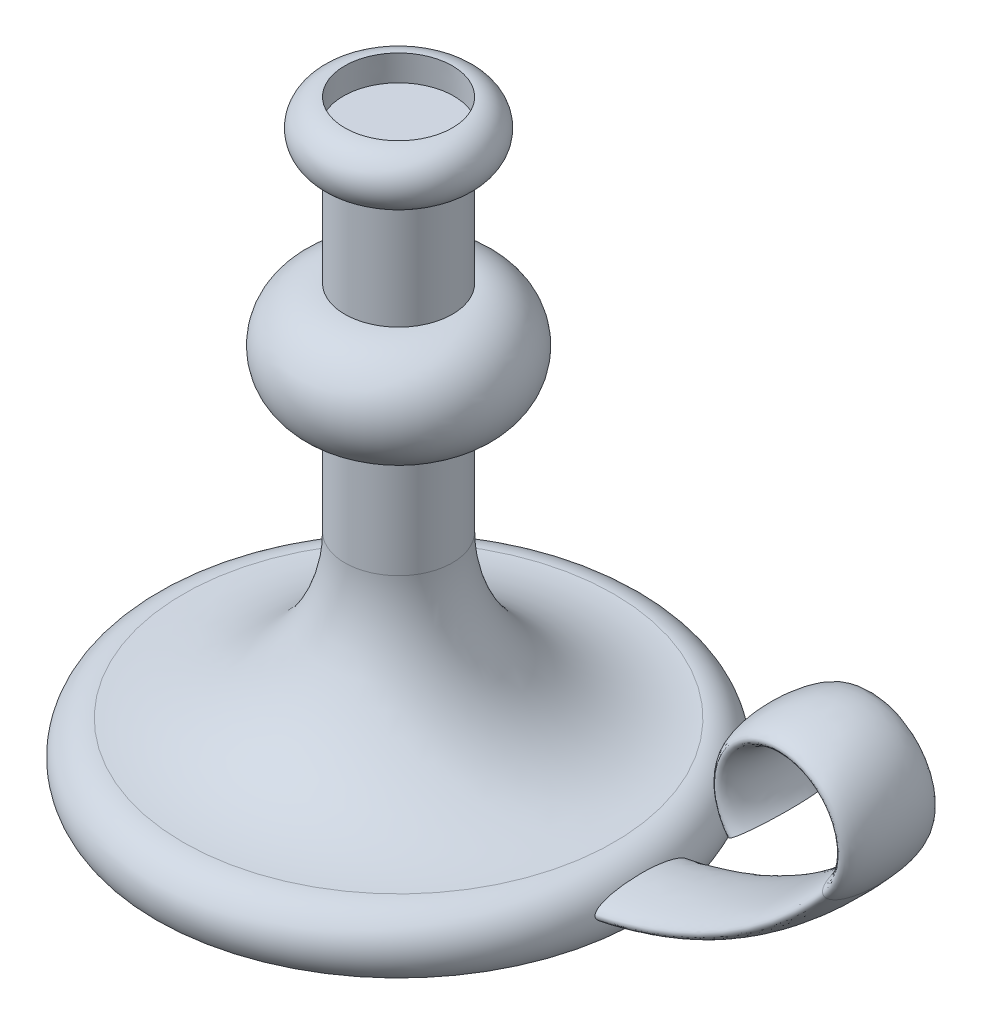
ISO-10303-21;
HEADER;
FILE_DESCRIPTION(('STEP AP214'),'2;1');
FILE_NAME('part.step','',(''),(''),'','','');
FILE_SCHEMA(('AUTOMOTIVE_DESIGN { 1 0 10303 214 1 1 1 1 }'));
ENDSEC;
DATA;
#1=APPLICATION_CONTEXT('core data for automotive mechanical design processes');
#2=APPLICATION_PROTOCOL_DEFINITION('international standard','automotive_design',2000,#1);
#3=PRODUCT_CONTEXT('',#1,'mechanical');
#4=PRODUCT('Part','Part','',(#3));
#5=PRODUCT_RELATED_PRODUCT_CATEGORY('part','',(#4));
#6=PRODUCT_DEFINITION_FORMATION('','',#4);
#7=PRODUCT_DEFINITION_CONTEXT('part definition',#1,'design');
#8=PRODUCT_DEFINITION('design','',#6,#7);
#9=PRODUCT_DEFINITION_SHAPE('','',#8);
#10=(LENGTH_UNIT() NAMED_UNIT(*) SI_UNIT(.MILLI.,.METRE.));
#11=(NAMED_UNIT(*) PLANE_ANGLE_UNIT() SI_UNIT($,.RADIAN.));
#12=(NAMED_UNIT(*) SI_UNIT($,.STERADIAN.) SOLID_ANGLE_UNIT());
#13=UNCERTAINTY_MEASURE_WITH_UNIT(LENGTH_MEASURE(1.E-05),#10,'distance_accuracy_value','');
#14=(GEOMETRIC_REPRESENTATION_CONTEXT(3) GLOBAL_UNCERTAINTY_ASSIGNED_CONTEXT((#13)) GLOBAL_UNIT_ASSIGNED_CONTEXT((#10,
#11,#12)) REPRESENTATION_CONTEXT('',''));
#15=CARTESIAN_POINT('',(0.,0.,0.));
#16=DIRECTION('',(0.,0.,1.));
#17=DIRECTION('',(1.,0.,0.));
#18=AXIS2_PLACEMENT_3D('',#15,#16,#17);
#19=CARTESIAN_POINT('',(-90.,7.50000000000001,0.));
#20=DIRECTION('',(0.,-1.,0.));
#21=DIRECTION('',(0.,0.,-1.));
#22=AXIS2_PLACEMENT_3D('',#19,#20,#21);
#23=TOROIDAL_SURFACE('',#22,80.,12.5);
#24=CARTESIAN_POINT('',(0.,15.,0.));
#25=CARTESIAN_POINT('',(4.00136066375103E-09,14.9999994497197,0.448956188430466));
#26=CARTESIAN_POINT('',(0.000296676791633574,14.9951315783748,0.89791029190739));
#27=CARTESIAN_POINT('',(0.00148426535672316,14.9755802493735,1.79561818556669));
#28=CARTESIAN_POINT('',(0.0023751969340055,14.9608965306953,2.24437197010465));
#29=CARTESIAN_POINT('',(0.00475618683708935,14.9214645130944,3.14163779596307));
#30=CARTESIAN_POINT('',(0.00624651153050312,14.8967117394729,3.5901496409155));
#31=CARTESIAN_POINT('',(0.00983950291390878,14.8367197750877,4.48646507343132));
#32=CARTESIAN_POINT('',(0.0119421583532634,14.8014807769919,4.93426867385563));
#33=CARTESIAN_POINT('',(0.0168039131396081,14.7196781019656,5.83105743053013));
#34=CARTESIAN_POINT('',(0.0195661808914007,14.6730597402329,6.28003761296034));
#35=CARTESIAN_POINT('',(0.0258101594271934,14.5676597295138,7.17660128498844));
#36=CARTESIAN_POINT('',(0.0292919120149101,14.5088773737711,7.62418469189589));
#37=CARTESIAN_POINT('',(0.0371035958626952,14.3779036804495,8.51695838149349));
#38=CARTESIAN_POINT('',(0.0414327251328532,14.3057250249644,8.96215052118495));
#39=CARTESIAN_POINT('',(0.0511767239490269,14.146095230462,9.84974625085139));
#40=CARTESIAN_POINT('',(0.056591411830917,14.0586466471249,10.292150294644));
#41=CARTESIAN_POINT('',(0.0658784735150738,13.9136040316498,10.9544618168075));
#42=CARTESIAN_POINT('',(0.0691831496444707,13.8627245941951,11.1758560246011));
#43=CARTESIAN_POINT('',(0.0762680996451903,13.7558982476464,11.6174559690568));
#44=CARTESIAN_POINT('',(0.080048450827369,13.6999505152239,11.8376615064446));
#45=CARTESIAN_POINT('',(0.0882009652144471,13.5823657906581,12.2767142381229));
#46=CARTESIAN_POINT('',(0.0925735548836065,13.5207247090667,12.495560333621));
#47=CARTESIAN_POINT('',(0.102073179815301,13.3909290728711,12.931675379863));
#48=CARTESIAN_POINT('',(0.10720137461062,13.3227645649532,13.1489413582842));
#49=CARTESIAN_POINT('',(0.118367024294746,13.1797701844285,13.5787081761395));
#50=CARTESIAN_POINT('',(0.124394280745832,13.1050184967943,13.7912351114996));
#51=CARTESIAN_POINT('',(0.13769755668382,12.9469808482804,14.2129907834615));
#52=CARTESIAN_POINT('',(0.144973166453467,12.8636976910841,14.4222205776829));
#53=CARTESIAN_POINT('',(0.16119666075411,12.6869711964811,14.8358640432876));
#54=CARTESIAN_POINT('',(0.170141201965216,12.5935483255053,15.0402864389843));
#55=CARTESIAN_POINT('',(0.185317365030083,12.4438654982324,15.3418951754295));
#56=CARTESIAN_POINT('',(0.190664702565056,12.3924214171975,15.4415220335929));
#57=CARTESIAN_POINT('',(0.202068003915101,12.28589634643,15.6387640974776));
#58=CARTESIAN_POINT('',(0.208123843766788,12.2308159936518,15.7363796516027));
#59=CARTESIAN_POINT('',(0.218955954607548,12.135340885532,15.8973174870784));
#60=CARTESIAN_POINT('',(0.223495860513944,12.0960912912869,15.9613357279317));
#61=CARTESIAN_POINT('',(0.233019106016297,12.0155253443327,16.0880386000506));
#62=CARTESIAN_POINT('',(0.238002489438599,11.9742087875346,16.1507230987499));
#63=CARTESIAN_POINT('',(0.248488516873019,11.8892199174485,16.274600871182));
#64=CARTESIAN_POINT('',(0.253992073685059,11.8455435228618,16.3357912772013));
#65=CARTESIAN_POINT('',(0.26559176639468,11.7556518236339,16.4562249162673));
#66=CARTESIAN_POINT('',(0.27168788231332,11.7094366046156,16.5154682148734));
#67=CARTESIAN_POINT('',(0.284622322029261,11.6137925179577,16.6320417668829));
#68=CARTESIAN_POINT('',(0.291466262659284,11.5643406331173,16.6893526157181));
#69=CARTESIAN_POINT('',(0.305972807821384,11.4622481172203,16.8009458739084));
#70=CARTESIAN_POINT('',(0.313635226151452,11.4096082126066,16.8552289678122));
#71=CARTESIAN_POINT('',(0.32990695913246,11.3008718633043,16.959908268499));
#72=CARTESIAN_POINT('',(0.338514690013063,11.2447812671999,17.0103107428832));
#73=CARTESIAN_POINT('',(0.356839384154058,11.1287808893653,17.1062491388969));
#74=CARTESIAN_POINT('',(0.366555633247546,11.0688735774328,17.151788157615));
#75=CARTESIAN_POINT('',(0.389218719599872,10.9333024827652,17.2446888818732));
#76=CARTESIAN_POINT('',(0.402429390401396,10.8567955376911,17.290779906632));
#77=CARTESIAN_POINT('',(0.430892815553735,10.6981155934272,17.3712869934412));
#78=CARTESIAN_POINT('',(0.446143620915371,10.6159480378477,17.4057140887813));
#79=CARTESIAN_POINT('',(0.470654566792556,10.4889246095076,17.4463446054981));
#80=CARTESIAN_POINT('',(0.47915766538093,10.4456629216364,17.4580924532366));
#81=CARTESIAN_POINT('',(0.496657520218973,10.358324899221,17.4774175517797));
#82=CARTESIAN_POINT('',(0.505654017614358,10.3142489997396,17.4849969669022));
#83=CARTESIAN_POINT('',(0.524082128789851,10.2256763713688,17.4957191379504));
#84=CARTESIAN_POINT('',(0.533513448539278,10.181179942573,17.4988648478313));
#85=CARTESIAN_POINT('',(0.552732604938945,10.0921886570592,17.5006242214686));
#86=CARTESIAN_POINT('',(0.562520406758551,10.0476938006105,17.4992383268242));
#87=CARTESIAN_POINT('',(0.589809326137845,9.92589657293411,17.4892286295307));
#88=CARTESIAN_POINT('',(0.607593578556012,9.84899848149995,17.4759587675723));
#89=CARTESIAN_POINT('',(0.643443935685934,9.69854273561217,17.4370059318332));
#90=CARTESIAN_POINT('',(0.661510282648553,9.62498819150613,17.4113116486536));
#91=CARTESIAN_POINT('',(0.705490110958442,9.45072180835713,17.336043039321));
#92=CARTESIAN_POINT('',(0.731336732448134,9.35240328839828,17.2809326566284));
#93=CARTESIAN_POINT('',(0.782155853050861,9.16542625609002,17.1556774097134));
#94=CARTESIAN_POINT('',(0.807124325252125,9.07680908468279,17.0854717160375));
#95=CARTESIAN_POINT('',(0.853839166700286,8.91572027289973,16.9412721247792));
#96=CARTESIAN_POINT('',(0.875678879513329,8.84251637772033,16.868109576555));
#97=CARTESIAN_POINT('',(0.918373454452256,8.702723130117,16.7157486254467));
#98=CARTESIAN_POINT('',(0.939229829477058,8.63612343030385,16.6365600195954));
#99=CARTESIAN_POINT('',(0.980118857943369,8.50825118052925,16.4733857441314));
#100=CARTESIAN_POINT('',(1.0001484937417,8.44699736840472,16.3893847863668));
#101=CARTESIAN_POINT('',(1.03938445815114,8.32924935876869,16.2179074493931));
#102=CARTESIAN_POINT('',(1.05859050132743,8.27275680493507,16.1304298852043));
#103=CARTESIAN_POINT('',(1.09692788915067,8.16190441683603,15.9495518254795));
#104=CARTESIAN_POINT('',(1.11603081334396,8.10769814100521,15.8560517188092));
#105=CARTESIAN_POINT('',(1.15348519635834,8.00312126922495,15.6667753392033));
#106=CARTESIAN_POINT('',(1.17183651710318,7.95275137660516,15.5709986531018));
#107=CARTESIAN_POINT('',(1.22589843096843,7.80652975916977,15.2806948213763));
#108=CARTESIAN_POINT('',(1.26056678967678,7.71570944684017,15.0834347297137));
#109=CARTESIAN_POINT('',(1.3275054151541,7.54457609231538,14.6839053773838));
#110=CARTESIAN_POINT('',(1.35977370807988,7.46427165811553,14.4816321722007));
#111=CARTESIAN_POINT('',(1.42228719387726,7.31196496634719,14.0726615329247));
#112=CARTESIAN_POINT('',(1.45252285536449,7.24000081269111,13.86594854247));
#113=CARTESIAN_POINT('',(1.51098018261334,7.10343955543567,13.4500936000043));
#114=CARTESIAN_POINT('',(1.53920398913047,7.03883457600462,13.2409545137203));
#115=CARTESIAN_POINT('',(1.59381509585393,6.91587362505721,12.820679420431));
#116=CARTESIAN_POINT('',(1.62020285829187,6.85751607871685,12.6095439313436));
#117=CARTESIAN_POINT('',(1.6782912141221,6.7309174626096,12.1273204890441));
#118=CARTESIAN_POINT('',(1.70945562867532,6.66437565537476,11.8557227000826));
#119=CARTESIAN_POINT('',(1.7691818432094,6.53886803603065,11.3104849250448));
#120=CARTESIAN_POINT('',(1.79774338427144,6.47990297737393,11.0368447387254));
#121=CARTESIAN_POINT('',(1.85241000916518,6.36860080545923,10.4878381875617));
#122=CARTESIAN_POINT('',(1.87851386423206,6.31626700314399,10.2124710319004));
#123=CARTESIAN_POINT('',(1.92835362791844,6.21755215774785,9.6604539345288));
#124=CARTESIAN_POINT('',(1.95208942645175,6.17117139138298,9.38380393380652));
#125=CARTESIAN_POINT('',(2.01973891760805,6.04035093105532,8.55392726465563));
#126=CARTESIAN_POINT('',(2.06025504694118,5.96391167526709,7.99914952971862));
#127=CARTESIAN_POINT('',(2.13266056647685,5.82927206017896,6.88700831967625));
#128=CARTESIAN_POINT('',(2.16455191558734,5.77106755882388,6.32964546101966));
#129=CARTESIAN_POINT('',(2.21994358359585,5.67100943205034,5.21453688546995));
#130=CARTESIAN_POINT('',(2.24346584393131,5.62911302376262,4.65679606852568));
#131=CARTESIAN_POINT('',(2.28242702411834,5.56016917445445,3.54009574455338));
#132=CARTESIAN_POINT('',(2.29786548909978,5.53312256901901,2.98113617072334));
#133=CARTESIAN_POINT('',(2.32077316771089,5.49311497106455,1.86240610711977));
#134=CARTESIAN_POINT('',(2.32824026547082,5.48015771831805,1.30263544151724));
#135=CARTESIAN_POINT('',(2.33524968984361,5.46799232440565,0.182909852228347));
#136=CARTESIAN_POINT('',(2.33479220290748,5.46878385975589,-0.377045066812897));
#137=CARTESIAN_POINT('',(2.32595173394535,5.48413308455225,-1.49645782109217));
#138=CARTESIAN_POINT('',(2.31757225399418,5.49868469108541,-2.05591576664592));
#139=CARTESIAN_POINT('',(2.29283413640675,5.54193872652747,-3.1741311483376));
#140=CARTESIAN_POINT('',(2.27647525493318,5.5706415878756,-3.73288856254529));
#141=CARTESIAN_POINT('',(2.23564355337782,5.64303913525244,-4.84952138059804));
#142=CARTESIAN_POINT('',(2.21116526811534,5.68674391978642,-5.40739593536645));
#143=CARTESIAN_POINT('',(2.15390006615734,5.79048248729832,-6.52118127632253));
#144=CARTESIAN_POINT('',(2.12111378868433,5.85051501403481,-7.07709221025748));
#145=CARTESIAN_POINT('',(2.0541204611787,5.97558716121164,-8.07841526432367));
#146=CARTESIAN_POINT('',(2.0214242352851,6.03739352007808,-8.52433259038765));
#147=CARTESIAN_POINT('',(1.95019218401476,6.17462063053653,-9.41360241823714));
#148=CARTESIAN_POINT('',(1.91165685165609,6.25004023281311,-9.85695513328457));
#149=CARTESIAN_POINT('',(1.84924904744865,6.37509852907475,-10.5188793676165));
#150=CARTESIAN_POINT('',(1.82769963174182,6.41872983515496,-10.7388141409483));
#151=CARTESIAN_POINT('',(1.78299844658497,6.51039197928664,-11.1775983577783));
#152=CARTESIAN_POINT('',(1.75984674016771,6.55842264429511,-11.3964478436082));
#153=CARTESIAN_POINT('',(1.71187544274957,6.65936243204591,-11.8327734041331));
#154=CARTESIAN_POINT('',(1.68705631775133,6.71227019328477,-12.0502498441261));
#155=CARTESIAN_POINT('',(1.6356552459579,6.82359622083417,-12.4835708027006));
#156=CARTESIAN_POINT('',(1.60907343411187,6.88201406544372,-12.6994154448044));
#157=CARTESIAN_POINT('',(1.56285228325073,6.98543097402565,-13.0601908839734));
#158=CARTESIAN_POINT('',(1.54371885650708,7.0287289087183,-13.2056747166128));
#159=CARTESIAN_POINT('',(1.50453796620535,7.11856455301719,-13.4955184679914));
#160=CARTESIAN_POINT('',(1.48449050424008,7.16510225697783,-13.6398783886885));
#161=CARTESIAN_POINT('',(1.44338900289861,7.26189329054609,-13.9275108742021));
#162=CARTESIAN_POINT('',(1.42233316464617,7.31215335500639,-14.0707809240799));
#163=CARTESIAN_POINT('',(1.37918305955226,7.41679388937564,-14.3556500390527));
#164=CARTESIAN_POINT('',(1.35708883153739,7.47117420527006,-14.4972491663782));
#165=CARTESIAN_POINT('',(1.30991676974758,7.58932557549082,-14.7899200827552));
#166=CARTESIAN_POINT('',(1.28474294822605,7.65350109369699,-14.9408142415825));
#167=CARTESIAN_POINT('',(1.23294136023365,7.78840456018522,-15.2394730429242));
#168=CARTESIAN_POINT('',(1.20631314348116,7.8591345425091,-15.3872366963552));
#169=CARTESIAN_POINT('',(1.15152425902849,8.00823786551704,-15.6780238059822));
#170=CARTESIAN_POINT('',(1.1233684184954,8.08658768646935,-15.8210601304825));
#171=CARTESIAN_POINT('',(1.06525806218454,8.25285449238241,-16.1010286055296));
#172=CARTESIAN_POINT('',(1.03530502312148,8.34076366962448,-16.2379656107973));
#173=CARTESIAN_POINT('',(0.979506895840379,8.50995847979828,-16.4764842107671));
#174=CARTESIAN_POINT('',(0.954031021702917,8.58907899731623,-16.5796774006535));
#175=CARTESIAN_POINT('',(0.901553047238521,8.75699774405995,-16.7780575724107));
#176=CARTESIAN_POINT('',(0.874547984665965,8.84581508910878,-16.8732280599377));
#177=CARTESIAN_POINT('',(0.832726364762453,8.9882531341359,-17.0071868586344));
#178=CARTESIAN_POINT('',(0.818462100669291,9.03764725540926,-17.0506465272524));
#179=CARTESIAN_POINT('',(0.78955831300976,9.1396435483334,-17.1335543255225));
#180=CARTESIAN_POINT('',(0.774918704270406,9.19224645192167,-17.1730015343997));
#181=CARTESIAN_POINT('',(0.745371465591174,9.3006145319494,-17.2467439737832));
#182=CARTESIAN_POINT('',(0.730465022567097,9.35636733673326,-17.2810576596561));
#183=CARTESIAN_POINT('',(0.700446875015215,9.47115244391441,-17.3434846395811));
#184=CARTESIAN_POINT('',(0.685335366463668,9.53018176174129,-17.371603464146));
#185=CARTESIAN_POINT('',(0.651883420448297,9.66401040390637,-17.4254586950433));
#186=CARTESIAN_POINT('',(0.633529222532389,9.73952431489098,-17.4494643441858));
#187=CARTESIAN_POINT('',(0.597227209589298,9.89360991536375,-17.4842543960026));
#188=CARTESIAN_POINT('',(0.57927895350963,9.97217800640714,-17.495053898554));
#189=CARTESIAN_POINT('',(0.544279807552026,10.1304546049939,-17.5022476016854));
#190=CARTESIAN_POINT('',(0.527231917168584,10.210165921869,-17.4985963943378));
#191=CARTESIAN_POINT('',(0.494572106072305,10.3679878233487,-17.4772137147976));
#192=CARTESIAN_POINT('',(0.478961519284778,10.4460968697125,-17.4594693071608));
#193=CARTESIAN_POINT('',(0.445814586185247,10.6174059753819,-17.4058885855391));
#194=CARTESIAN_POINT('',(0.428740142884819,10.7096282448974,-17.3666903139956));
#195=CARTESIAN_POINT('',(0.397107912736479,10.8870855268672,-17.2738241098204));
#196=CARTESIAN_POINT('',(0.382559020961001,10.9722953084673,-17.2201066728658));
#197=CARTESIAN_POINT('',(0.357873695826012,11.1221437912039,-17.1119129407358));
#198=CARTESIAN_POINT('',(0.347404531533679,11.1878727293404,-17.0589847922131));
#199=CARTESIAN_POINT('',(0.327801842536102,11.3145468526521,-16.9476847722581));
#200=CARTESIAN_POINT('',(0.318666410798626,11.3754988092106,-16.8893208727741));
#201=CARTESIAN_POINT('',(0.301474774433072,11.4933860711778,-16.7681865356141));
#202=CARTESIAN_POINT('',(0.293422151509892,11.5503077649902,-16.7054024719816));
#203=CARTESIAN_POINT('',(0.278249232253772,11.6604071170972,-16.5765156028998));
#204=CARTESIAN_POINT('',(0.271129249474089,11.7135835134606,-16.5104116915992));
#205=CARTESIAN_POINT('',(0.251744208739733,11.8619944817705,-16.3162397321825));
#206=CARTESIAN_POINT('',(0.240469296673406,11.9530318586825,-16.1848642829685));
#207=CARTESIAN_POINT('',(0.219932564134059,12.1257956488315,-15.9158226080988));
#208=CARTESIAN_POINT('',(0.210673804221832,12.2075078179556,-15.7781471970731));
#209=CARTESIAN_POINT('',(0.193682542169238,12.3632547645709,-15.4983218325458));
#210=CARTESIAN_POINT('',(0.185951202811857,12.4372836728148,-15.356168564894));
#211=CARTESIAN_POINT('',(0.171638861897949,12.5791850443386,-15.0679814824583));
#212=CARTESIAN_POINT('',(0.165063287392445,12.6470277787905,-14.9219328843867));
#213=CARTESIAN_POINT('',(0.152855730008377,12.7770802203035,-14.6274984422368));
#214=CARTESIAN_POINT('',(0.147222809397824,12.8392954967793,-14.4791150834765));
#215=CARTESIAN_POINT('',(0.136706009623449,12.9588969882584,-14.1804369079987));
#216=CARTESIAN_POINT('',(0.131821965657471,13.0162842644813,-14.0301425197402));
#217=CARTESIAN_POINT('',(0.121405936070332,13.1419481726649,-13.686675989007));
#218=CARTESIAN_POINT('',(0.11606202532566,13.2089108582432,-13.4930181564866));
#219=CARTESIAN_POINT('',(0.106137873804903,13.3369190811422,-13.1037268392805));
#220=CARTESIAN_POINT('',(0.101557717595538,13.3979639629012,-12.908093138357));
#221=CARTESIAN_POINT('',(0.0930025729445725,13.514870991614,-12.5151733108002));
#222=CARTESIAN_POINT('',(0.0890278748627422,13.5707306469022,-12.317886438903));
#223=CARTESIAN_POINT('',(0.0815699590942184,13.6777943859889,-11.9220405548435));
#224=CARTESIAN_POINT('',(0.0780867664882952,13.7289982321611,-11.7234814783026));
#225=CARTESIAN_POINT('',(0.068254817384734,13.8760522417917,-11.1273371329439));
#226=CARTESIAN_POINT('',(0.0625011103101949,13.9656628473225,-10.728194973237));
#227=CARTESIAN_POINT('',(0.0521128978390205,14.1308358772329,-9.92713912078157));
#228=CARTESIAN_POINT('',(0.0474781502954875,14.2064013402163,-9.52522604706719));
#229=CARTESIAN_POINT('',(0.0380240488500783,14.3622839867773,-8.62094793646116));
#230=CARTESIAN_POINT('',(0.0334356795995107,14.4392602667863,-8.11800526027913));
#231=CARTESIAN_POINT('',(0.0252663204600051,14.5767718846832,-7.1097635166019));
#232=CARTESIAN_POINT('',(0.0216856017909233,14.6373027959742,-6.60446385183166));
#233=CARTESIAN_POINT('',(0.0153888377796762,14.743525278235,-5.59224751844832));
#234=CARTESIAN_POINT('',(0.0126729030563662,14.7892149508024,-5.08533065134036));
#235=CARTESIAN_POINT('',(0.00803780031937021,14.8668680302619,-4.07017088274939));
#236=CARTESIAN_POINT('',(0.00611907229876246,14.8988238575253,-3.56192740437793));
#237=CARTESIAN_POINT('',(0.00305458103020622,14.9496805977589,-2.54487002794396));
#238=CARTESIAN_POINT('',(0.00190869705913493,14.9685835496817,-2.03605623141237));
#239=CARTESIAN_POINT('',(0.000381438032056879,14.9937430043885,-1.01816071124354));
#240=CARTESIAN_POINT('',(-4.53721053147645E-09,15.0000006239722,-0.509079015238947));
#241=CARTESIAN_POINT('',(0.,15.,0.));
#242=B_SPLINE_CURVE_WITH_KNOTS('',3,(#24,#25,#26,#27,#28,#29,#30,#31,#32,#33,#34,#35,#36,#37,
#38,#39,#40,#41,#42,#43,#44,#45,#46,#47,#48,#49,#50,#51,#52,#53,#54,#55,#56,#57,#58,#59,#60,#61,
#62,#63,#64,#65,#66,#67,#68,#69,#70,#71,#72,#73,#74,#75,#76,#77,#78,#79,#80,#81,#82,#83,#84,#85,
#86,#87,#88,#89,#90,#91,#92,#93,#94,#95,#96,#97,#98,#99,#100,#101,#102,#103,#104,#105,#106,#107,
#108,#109,#110,#111,#112,#113,#114,#115,#116,#117,#118,#119,#120,#121,#122,#123,#124,#125,#126,
#127,#128,#129,#130,#131,#132,#133,#134,#135,#136,#137,#138,#139,#140,#141,#142,#143,#144,#145,
#146,#147,#148,#149,#150,#151,#152,#153,#154,#155,#156,#157,#158,#159,#160,#161,#162,#163,#164,
#165,#166,#167,#168,#169,#170,#171,#172,#173,#174,#175,#176,#177,#178,#179,#180,#181,#182,#183,
#184,#185,#186,#187,#188,#189,#190,#191,#192,#193,#194,#195,#196,#197,#198,#199,#200,#201,#202,
#203,#204,#205,#206,#207,#208,#209,#210,#211,#212,#213,#214,#215,#216,#217,#218,#219,#220,#221,
#222,#223,#224,#225,#226,#227,#228,#229,#230,#231,#232,#233,#234,#235,#236,#237,#238,#239,#240,
#241),.UNSPECIFIED.,.T.,.F.,(4,2,2,2,2,2,2,2,2,2,2,2,2,2,2,2,2,2,2,2,2,2,2,2,2,2,2,2,2,2,2,2,2,
2,2,2,2,2,2,2,2,2,2,2,2,2,2,2,2,2,2,2,2,2,2,2,2,2,2,2,2,2,2,2,2,2,2,2,2,2,2,2,2,2,2,2,2,2,2,2,2,
2,2,2,2,2,2,2,2,2,2,2,2,2,2,2,2,2,2,2,2,2,2,2,2,2,2,2,4),(0.,1.346838178073,2.69371217254969,
4.04118537431456,5.38863381989019,6.74268966754053,8.09682421106799,9.44968329290347,
10.8023161675831,11.4838363142235,12.1654673708803,12.8475918981093,13.5307743142807,
14.2067256840409,14.8824556252824,15.5568461544413,15.8935431911445,16.2301814053722,
16.4558353983693,16.6815117162762,16.9075916755699,17.1336640149105,17.3615692672034,
17.5894227814982,17.816900213166,18.0442319105465,18.3143586068524,18.5842290634297,
18.720941694724,18.8575832754269,18.9941337756026,19.1306709695049,19.3695368086808,
19.6086204872939,19.9535489788293,20.2998943852242,20.6167538518601,20.933108750627,
21.2505313523225,21.5680630893468,21.8972076574735,22.2264124236194,22.8856739800345,
23.5454718598217,24.208174288764,24.8701606906294,25.5319798271464,26.3759166206289,
27.2199372726464,28.0643776918559,28.9088573491356,30.592830027518,32.276419910857,
33.9555627852735,35.6348001338644,37.3144830979509,38.9941265422198,40.6730278136763,
42.3519803927932,44.0320653780316,45.7120211356303,47.0659170242281,48.4196986618573,
49.095419885436,49.7711145418117,50.4466211373933,51.1220760765822,51.5810153017242,
52.0399537271413,52.4997438077634,52.9595167099573,53.4570669664839,53.954772147798,
54.4509871078256,54.9467997800064,55.3439123607019,55.7418224281828,55.9436269851228,
56.1454777479716,56.3465844420864,56.5475108624025,56.7904958678751,57.0332027842976,
57.2766729541853,57.5203668517872,57.8236245382722,58.1279295433937,58.3826789188051,
58.6370603974203,58.8922636382309,59.1475524592547,59.6276369865908,60.1084452888057,
60.5896182184707,61.0729934733369,61.5558849810088,62.0386700677709,62.653484813087,
63.268367588628,63.8835443215981,64.4987524347497,65.7257653079943,66.9525124127198,
68.478641482176,70.005180933442,71.5319155736602,73.0594917311298,74.5868292162545,
76.1140318053904),.UNSPECIFIED.);
#243=CARTESIAN_POINT('',(0.,15.,0.));
#244=VERTEX_POINT('',#243);
#245=EDGE_CURVE('E11',#244,#244,#242,.T.);
#246=ORIENTED_EDGE('',*,*,#245,.F.);
#247=EDGE_LOOP('',(#246));
#248=FACE_BOUND('',#247,.T.);
#249=CARTESIAN_POINT('',(-90.,20.,0.));
#250=DIRECTION('',(0.,-1.,0.));
#251=DIRECTION('',(0.,0.,-1.));
#252=AXIS2_PLACEMENT_3D('',#249,#250,#251);
#253=CIRCLE('',#252,80.);
#254=CARTESIAN_POINT('',(-90.,20.,-80.));
#255=VERTEX_POINT('',#254);
#256=EDGE_CURVE('E54',#255,#255,#253,.T.);
#257=ORIENTED_EDGE('',*,*,#256,.T.);
#258=EDGE_LOOP('',(#257));
#259=FACE_BOUND('',#258,.T.);
#260=CARTESIAN_POINT('',(-90.,0.,0.));
#261=DIRECTION('',(0.,-1.,0.));
#262=DIRECTION('',(0.,0.,-1.));
#263=AXIS2_PLACEMENT_3D('',#260,#261,#262);
#264=CIRCLE('',#263,90.);
#265=CARTESIAN_POINT('',(-90.,0.,-90.));
#266=VERTEX_POINT('',#265);
#267=EDGE_CURVE('E47',#266,#266,#264,.T.);
#268=ORIENTED_EDGE('',*,*,#267,.F.);
#269=EDGE_LOOP('',(#268));
#270=FACE_BOUND('',#269,.T.);
#271=ADVANCED_FACE('F37',(#248,#259,#270),#23,.T.);
#272=CARTESIAN_POINT('',(0.,0.,0.));
#273=DIRECTION('',(0.,-1.,0.));
#274=DIRECTION('',(0.,0.,-1.));
#275=AXIS2_PLACEMENT_3D('',#272,#273,#274);
#276=PLANE('',#275);
#277=ORIENTED_EDGE('',*,*,#267,.T.);
#278=EDGE_LOOP('',(#277));
#279=FACE_BOUND('',#278,.T.);
#280=ADVANCED_FACE('F78',(#279),#276,.T.);
#281=CARTESIAN_POINT('',(-90.,210.,0.));
#282=DIRECTION('',(0.,-1.,0.));
#283=DIRECTION('',(0.,0.,-1.));
#284=AXIS2_PLACEMENT_3D('',#281,#282,#283);
#285=TOROIDAL_SURFACE('',#284,20.,10.);
#286=CARTESIAN_POINT('',(-90.,220.,0.));
#287=DIRECTION('',(0.,1.,0.));
#288=DIRECTION('',(0.,0.,1.));
#289=AXIS2_PLACEMENT_3D('',#286,#287,#288);
#290=CIRCLE('',#289,20.);
#291=CARTESIAN_POINT('',(-90.,220.,20.));
#292=VERTEX_POINT('',#291);
#293=EDGE_CURVE('E139',#292,#292,#290,.T.);
#294=ORIENTED_EDGE('',*,*,#293,.F.);
#295=EDGE_LOOP('',(#294));
#296=FACE_BOUND('',#295,.T.);
#297=CARTESIAN_POINT('',(-90.,200.,0.));
#298=DIRECTION('',(0.,-1.,0.));
#299=DIRECTION('',(0.,0.,-1.));
#300=AXIS2_PLACEMENT_3D('',#297,#298,#299);
#301=CIRCLE('',#300,20.);
#302=CARTESIAN_POINT('',(-90.,200.,-20.));
#303=VERTEX_POINT('',#302);
#304=EDGE_CURVE('E73',#303,#303,#301,.T.);
#305=ORIENTED_EDGE('',*,*,#304,.F.);
#306=EDGE_LOOP('',(#305));
#307=FACE_BOUND('',#306,.T.);
#308=ADVANCED_FACE('F85',(#296,#307),#285,.T.);
#309=CARTESIAN_POINT('',(-90.,0.,0.));
#310=DIRECTION('',(0.,-1.,0.));
#311=DIRECTION('',(0.,0.,-1.));
#312=AXIS2_PLACEMENT_3D('',#309,#310,#311);
#313=CYLINDRICAL_SURFACE('',#312,20.);
#314=ORIENTED_EDGE('',*,*,#304,.T.);
#315=EDGE_LOOP('',(#314));
#316=FACE_BOUND('',#315,.T.);
#317=CARTESIAN_POINT('',(-90.,160.,0.));
#318=DIRECTION('',(0.,-1.,0.));
#319=DIRECTION('',(0.,0.,-1.));
#320=AXIS2_PLACEMENT_3D('',#317,#318,#319);
#321=CIRCLE('',#320,20.);
#322=CARTESIAN_POINT('',(-90.,160.,-20.));
#323=VERTEX_POINT('',#322);
#324=EDGE_CURVE('E70',#323,#323,#321,.T.);
#325=ORIENTED_EDGE('',*,*,#324,.F.);
#326=EDGE_LOOP('',(#325));
#327=FACE_BOUND('',#326,.T.);
#328=ADVANCED_FACE('F147',(#316,#327),#313,.T.);
#329=CARTESIAN_POINT('',(-90.,140.,0.));
#330=DIRECTION('',(0.,-1.,0.));
#331=DIRECTION('',(0.,0.,-1.));
#332=AXIS2_PLACEMENT_3D('',#329,#330,#331);
#333=TOROIDAL_SURFACE('',#332,20.,20.);
#334=ORIENTED_EDGE('',*,*,#324,.T.);
#335=EDGE_LOOP('',(#334));
#336=FACE_BOUND('',#335,.T.);
#337=CARTESIAN_POINT('',(-90.,120.,0.));
#338=DIRECTION('',(0.,-1.,0.));
#339=DIRECTION('',(0.,0.,-1.));
#340=AXIS2_PLACEMENT_3D('',#337,#338,#339);
#341=CIRCLE('',#340,20.);
#342=CARTESIAN_POINT('',(-90.,120.,-20.));
#343=VERTEX_POINT('',#342);
#344=EDGE_CURVE('E67',#343,#343,#341,.T.);
#345=ORIENTED_EDGE('',*,*,#344,.F.);
#346=EDGE_LOOP('',(#345));
#347=FACE_BOUND('',#346,.T.);
#348=ADVANCED_FACE('F103',(#336,#347),#333,.T.);
#349=CARTESIAN_POINT('',(-90.,0.,0.));
#350=DIRECTION('',(0.,-1.,0.));
#351=DIRECTION('',(0.,0.,-1.));
#352=AXIS2_PLACEMENT_3D('',#349,#350,#351);
#353=CYLINDRICAL_SURFACE('',#352,20.);
#354=ORIENTED_EDGE('',*,*,#344,.T.);
#355=EDGE_LOOP('',(#354));
#356=FACE_BOUND('',#355,.T.);
#357=CARTESIAN_POINT('',(-90.,80.,0.));
#358=DIRECTION('',(0.,-1.,0.));
#359=DIRECTION('',(0.,0.,-1.));
#360=AXIS2_PLACEMENT_3D('',#357,#358,#359);
#361=CIRCLE('',#360,20.);
#362=CARTESIAN_POINT('',(-90.,80.,-20.));
#363=VERTEX_POINT('',#362);
#364=EDGE_CURVE('E58',#363,#363,#361,.T.);
#365=ORIENTED_EDGE('',*,*,#364,.F.);
#366=EDGE_LOOP('',(#365));
#367=FACE_BOUND('',#366,.T.);
#368=ADVANCED_FACE('F92',(#356,#367),#353,.T.);
#369=CARTESIAN_POINT('',(-90.,80.,0.));
#370=DIRECTION('',(0.,-1.,0.));
#371=DIRECTION('',(0.,0.,-1.));
#372=AXIS2_PLACEMENT_3D('',#369,#370,#371);
#373=TOROIDAL_SURFACE('',#372,80.,60.);
#374=ORIENTED_EDGE('',*,*,#364,.T.);
#375=EDGE_LOOP('',(#374));
#376=FACE_BOUND('',#375,.T.);
#377=ORIENTED_EDGE('',*,*,#256,.F.);
#378=EDGE_LOOP('',(#377));
#379=FACE_BOUND('',#378,.T.);
#380=ADVANCED_FACE('F90',(#376,#379),#373,.F.);
#381=CARTESIAN_POINT('',(50.5859980880104,60.4401656537236,0.));
#382=DIRECTION('',(0.489310274474785,-0.872109772501954,0.));
#383=DIRECTION('',(0.,0.,-1.));
#384=AXIS2_PLACEMENT_3D('',#381,#382,#383);
#385=PLANE('',#384);
#386=CARTESIAN_POINT('',(50.5859980880104,60.4401656537236,0.));
#387=DIRECTION('',(0.489310274474785,-0.872109772501954,0.));
#388=DIRECTION('',(0.,0.,1.));
#389=AXIS2_PLACEMENT_3D('',#386,#387,#388);
#390=ELLIPSE('',#389,17.5,5.);
#391=CARTESIAN_POINT('',(50.5859980880104,60.4401656537236,17.5));
#392=VERTEX_POINT('',#391);
#393=EDGE_CURVE('E51',#392,#392,#390,.T.);
#394=ORIENTED_EDGE('',*,*,#393,.T.);
#395=EDGE_LOOP('',(#394));
#396=FACE_BOUND('',#395,.T.);
#397=ADVANCED_FACE('F52',(#396),#385,.T.);
#398=CARTESIAN_POINT('',(0.,10.,17.5));
#399=CARTESIAN_POINT('',(33.4434544166714,16.6886908833343,17.5));
#400=CARTESIAN_POINT('',(62.9425368270175,33.8061488137744,17.5));
#401=CARTESIAN_POINT('',(85.3445351431856,59.5229468355963,17.5));
#402=CARTESIAN_POINT('',(0.,0.,17.5));
#403=CARTESIAN_POINT('',(35.6730180444495,6.68869088333429,17.5));
#404=CARTESIAN_POINT('',(67.2825218648235,24.5252283937981,17.5));
#405=CARTESIAN_POINT('',(91.4502482528205,51.603334002709,17.5));
#406=CARTESIAN_POINT('',(0.,0.,-17.5));
#407=CARTESIAN_POINT('',(35.6730180444495,6.68869088333429,-17.5));
#408=CARTESIAN_POINT('',(67.2825218648235,24.5252283937981,-17.5));
#409=CARTESIAN_POINT('',(91.4502482528205,51.603334002709,-17.5));
#410=CARTESIAN_POINT('',(0.,10.,-17.5));
#411=CARTESIAN_POINT('',(33.4434544166714,16.6886908833343,-17.5));
#412=CARTESIAN_POINT('',(62.9425368270175,33.8061488137744,-17.5));
#413=CARTESIAN_POINT('',(85.3445351431856,59.5229468355963,-17.5));
#414=CARTESIAN_POINT('',(0.,20.,-17.5));
#415=CARTESIAN_POINT('',(31.2138907888933,26.6886908833343,-17.5));
#416=CARTESIAN_POINT('',(58.6025517892116,43.0870692337506,-17.5));
#417=CARTESIAN_POINT('',(79.2388220335507,67.4425596684835,-17.5));
#418=CARTESIAN_POINT('',(0.,20.,17.5));
#419=CARTESIAN_POINT('',(31.2138907888933,26.6886908833343,17.5));
#420=CARTESIAN_POINT('',(58.6025517892116,43.0870692337506,17.5));
#421=CARTESIAN_POINT('',(79.2388220335507,67.4425596684835,17.5));
#422=CARTESIAN_POINT('',(0.,10.,17.5));
#423=CARTESIAN_POINT('',(33.4434544166714,16.6886908833343,17.5));
#424=CARTESIAN_POINT('',(62.9425368270175,33.8061488137744,17.5));
#425=CARTESIAN_POINT('',(85.3445351431856,59.5229468355963,17.5));
#426=(BOUNDED_SURFACE() B_SPLINE_SURFACE(3,3,((#398,#399,#400,#401),(#402,#403,#404,#405),(#406,
#407,#408,#409),(#410,#411,#412,#413),(#414,#415,#416,#417),(#418,#419,#420,#421),(#422,#423,
#424,#425)),.UNSPECIFIED.,.T.,.F.,.F.) B_SPLINE_SURFACE_WITH_KNOTS((4,3,4),(4,4),(0.,0.5,1.),
(0.,1.),.UNSPECIFIED.) GEOMETRIC_REPRESENTATION_ITEM() RATIONAL_B_SPLINE_SURFACE(((1.,
0.964375026495208,0.964375026495208,1.),(0.333333333333333,0.321458342165069,0.321458342165069,
0.333333333333333),(0.333333333333333,0.321458342165069,0.321458342165069,0.333333333333333),
(1.,0.964375026495208,0.964375026495208,1.),(0.333333333333333,0.321458342165069,
0.321458342165069,0.333333333333333),(0.333333333333333,0.321458342165069,0.321458342165069,
0.333333333333333),(1.,0.964375026495208,0.964375026495208,1.))) REPRESENTATION_ITEM('') SURFACE());
#427=CARTESIAN_POINT('',(85.3445351431856,59.5229468355963,0.));
#428=DIRECTION('',(0.791961283288723,0.610571310963493,0.));
#429=DIRECTION('',(0.,0.,1.));
#430=AXIS2_PLACEMENT_3D('',#427,#428,#429);
#431=ELLIPSE('',#430,17.5,5.);
#432=CARTESIAN_POINT('',(85.3445351431856,59.5229468355963,17.5));
#433=VERTEX_POINT('',#432);
#434=EDGE_CURVE('E55',#433,#433,#431,.T.);
#435=ORIENTED_EDGE('',*,*,#245,.T.);
#436=EDGE_LOOP('',(#435));
#437=FACE_BOUND('',#436,.T.);
#438=ORIENTED_EDGE('',*,*,#434,.F.);
#439=EDGE_LOOP('',(#438));
#440=FACE_BOUND('',#439,.T.);
#441=ADVANCED_FACE('F100',(#437,#440),#426,.T.);
#442=CARTESIAN_POINT('',(85.3445351431856,59.5229468355963,17.5));
#443=CARTESIAN_POINT('',(100.708858335999,76.3822056122695,17.5));
#444=CARTESIAN_POINT('',(91.7697837687409,97.3676762896944,17.5));
#445=CARTESIAN_POINT('',(68.9677009511319,97.9693845669907,17.5));
#446=CARTESIAN_POINT('',(46.1656181335228,98.571092844287,17.5));
#447=CARTESIAN_POINT('',(36.1322129808739,78.086273716092,17.5));
#448=CARTESIAN_POINT('',(50.5859980880104,60.4401656537236,17.5));
#449=CARTESIAN_POINT('',(91.4502482528206,51.603334002709,17.5));
#450=CARTESIAN_POINT('',(114.676500317617,74.5238338013352,17.5));
#451=CARTESIAN_POINT('',(103.496377498395,105.180202629743,17.5));
#452=CARTESIAN_POINT('',(70.9677009511319,107.767343538123,17.5));
#453=CARTESIAN_POINT('',(38.4390244038689,110.354484446504,17.5));
#454=CARTESIAN_POINT('',(22.55365232752,81.8507469724069,17.5));
#455=CARTESIAN_POINT('',(41.8649003629909,55.5470629089758,17.5));
#456=CARTESIAN_POINT('',(91.4502482528206,51.603334002709,-17.5));
#457=CARTESIAN_POINT('',(114.676500317617,74.5238338013352,-17.5));
#458=CARTESIAN_POINT('',(103.496377498395,105.180202629743,-17.5));
#459=CARTESIAN_POINT('',(70.9677009511319,107.767343538123,-17.5));
#460=CARTESIAN_POINT('',(38.4390244038689,110.354484446504,-17.5));
#461=CARTESIAN_POINT('',(22.55365232752,81.8507469724069,-17.5));
#462=CARTESIAN_POINT('',(41.8649003629909,55.5470629089758,-17.5));
#463=CARTESIAN_POINT('',(85.3445351431856,59.5229468355963,-17.5));
#464=CARTESIAN_POINT('',(100.708858335999,76.3822056122695,-17.5));
#465=CARTESIAN_POINT('',(91.7697837687409,97.3676762896944,-17.5));
#466=CARTESIAN_POINT('',(68.9677009511319,97.9693845669907,-17.5));
#467=CARTESIAN_POINT('',(46.1656181335228,98.571092844287,-17.5));
#468=CARTESIAN_POINT('',(36.1322129808739,78.086273716092,-17.5));
#469=CARTESIAN_POINT('',(50.5859980880104,60.4401656537236,-17.5));
#470=CARTESIAN_POINT('',(79.2388220335507,67.4425596684835,-17.5));
#471=CARTESIAN_POINT('',(86.7412163543819,78.2405774232038,-17.5));
#472=CARTESIAN_POINT('',(80.0431900390869,89.5551499496455,-17.5));
#473=CARTESIAN_POINT('',(66.9677009511319,88.171425595858,-17.5));
#474=CARTESIAN_POINT('',(53.8922118631769,86.7877012420704,-17.5));
#475=CARTESIAN_POINT('',(49.7107736342277,74.3218004597773,-17.5));
#476=CARTESIAN_POINT('',(59.30709581303,65.3332683984715,-17.5));
#477=CARTESIAN_POINT('',(79.2388220335507,67.4425596684835,17.5));
#478=CARTESIAN_POINT('',(86.7412163543819,78.2405774232038,17.5));
#479=CARTESIAN_POINT('',(80.0431900390869,89.5551499496455,17.5));
#480=CARTESIAN_POINT('',(66.9677009511319,88.171425595858,17.5));
#481=CARTESIAN_POINT('',(53.8922118631769,86.7877012420704,17.5));
#482=CARTESIAN_POINT('',(49.7107736342277,74.3218004597773,17.5));
#483=CARTESIAN_POINT('',(59.30709581303,65.3332683984715,17.5));
#484=CARTESIAN_POINT('',(85.3445351431856,59.5229468355963,17.5));
#485=CARTESIAN_POINT('',(100.708858335999,76.3822056122695,17.5));
#486=CARTESIAN_POINT('',(91.7697837687409,97.3676762896944,17.5));
#487=CARTESIAN_POINT('',(68.9677009511319,97.9693845669907,17.5));
#488=CARTESIAN_POINT('',(46.1656181335228,98.571092844287,17.5));
#489=CARTESIAN_POINT('',(36.1322129808739,78.086273716092,17.5));
#490=CARTESIAN_POINT('',(50.5859980880104,60.4401656537236,17.5));
#491=(BOUNDED_SURFACE() B_SPLINE_SURFACE(3,3,((#442,#443,#444,#445,#446,#447,#448),(#449,#450,
#451,#452,#453,#454,#455),(#456,#457,#458,#459,#460,#461,#462),(#463,#464,#465,#466,#467,#468,
#469),(#470,#471,#472,#473,#474,#475,#476),(#477,#478,#479,#480,#481,#482,#483),(#484,#485,#486,
#487,#488,#489,#490)),.UNSPECIFIED.,.T.,.F.,.F.) B_SPLINE_SURFACE_WITH_KNOTS((4,3,4),(4,3,4),
(0.,0.5,1.),(0.,0.5,1.),
.UNSPECIFIED.) GEOMETRIC_REPRESENTATION_ITEM() RATIONAL_B_SPLINE_SURFACE(((1.,0.610683431445948,
0.610683431445948,1.,0.610683431445948,0.610683431445948,1.),(0.333333333333333,
0.203561143815316,0.203561143815316,0.333333333333333,0.203561143815316,0.203561143815316,
0.333333333333333),(0.333333333333333,0.203561143815316,0.203561143815316,0.333333333333333,
0.203561143815316,0.203561143815316,0.333333333333333),(1.,0.610683431445948,0.610683431445948,
1.,0.610683431445948,0.610683431445948,1.),(0.333333333333333,0.203561143815316,
0.203561143815316,0.333333333333333,0.203561143815316,0.203561143815316,0.333333333333333),
(0.333333333333333,0.203561143815316,0.203561143815316,0.333333333333333,0.203561143815316,
0.203561143815316,0.333333333333333),(1.,0.610683431445948,0.610683431445948,1.,
0.610683431445948,0.610683431445948,1.))) REPRESENTATION_ITEM('') SURFACE());
#492=ORIENTED_EDGE('',*,*,#393,.F.);
#493=EDGE_LOOP('',(#492));
#494=FACE_BOUND('',#493,.T.);
#495=ORIENTED_EDGE('',*,*,#434,.T.);
#496=EDGE_LOOP('',(#495));
#497=FACE_BOUND('',#496,.T.);
#498=ADVANCED_FACE('F95',(#494,#497),#491,.T.);
#499=CARTESIAN_POINT('',(-90.,220.,0.));
#500=DIRECTION('',(0.,-1.,0.));
#501=DIRECTION('',(0.,0.,1.));
#502=AXIS2_PLACEMENT_3D('',#499,#500,#501);
#503=CONICAL_SURFACE('',#502,20.,0.0523598775598299);
#504=CARTESIAN_POINT('',(-90.,210.,0.));
#505=DIRECTION('',(0.,1.,0.));
#506=DIRECTION('',(0.,0.,1.));
#507=AXIS2_PLACEMENT_3D('',#504,#505,#506);
#508=CIRCLE('',#507,20.5240777928304);
#509=CARTESIAN_POINT('',(-90.,210.,20.5240777928304));
#510=VERTEX_POINT('',#509);
#511=EDGE_CURVE('E61',#510,#510,#508,.T.);
#512=ORIENTED_EDGE('',*,*,#511,.F.);
#513=EDGE_LOOP('',(#512));
#514=FACE_BOUND('',#513,.T.);
#515=ORIENTED_EDGE('',*,*,#293,.T.);
#516=EDGE_LOOP('',(#515));
#517=FACE_BOUND('',#516,.T.);
#518=ADVANCED_FACE('F102',(#514,#517),#503,.F.);
#519=CARTESIAN_POINT('',(-90.,210.,0.));
#520=DIRECTION('',(0.,1.,0.));
#521=DIRECTION('',(0.,0.,1.));
#522=AXIS2_PLACEMENT_3D('',#519,#520,#521);
#523=PLANE('',#522);
#524=ORIENTED_EDGE('',*,*,#511,.T.);
#525=EDGE_LOOP('',(#524));
#526=FACE_BOUND('',#525,.T.);
#527=ADVANCED_FACE('F112',(#526),#523,.T.);
#528=CLOSED_SHELL('',(#271,#280,#308,#328,#348,#368,#380,#397,#441,#498,#518,#527));
#529=MANIFOLD_SOLID_BREP('B2',#528);
#530=ADVANCED_BREP_SHAPE_REPRESENTATION('',(#18,#529),#14);
#531=SHAPE_DEFINITION_REPRESENTATION(#9,#530);
ENDSEC;
END-ISO-10303-21;
